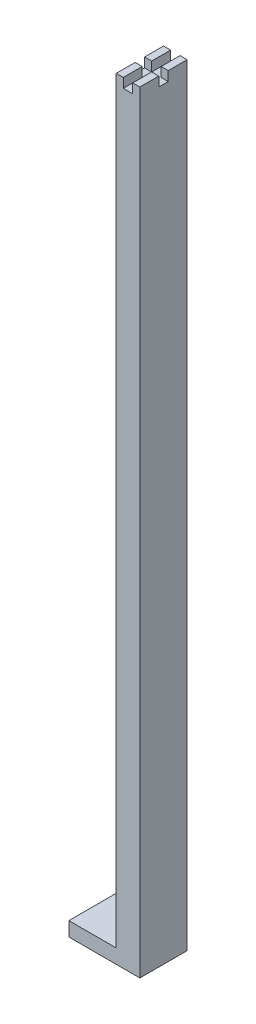
ISO-10303-21;
HEADER;
FILE_DESCRIPTION(('STEP AP214'),'2;1');
FILE_NAME('part.step','',(''),(''),'','','');
FILE_SCHEMA(('AUTOMOTIVE_DESIGN { 1 0 10303 214 1 1 1 1 }'));
ENDSEC;
DATA;
#1=APPLICATION_CONTEXT('core data for automotive mechanical design processes');
#2=APPLICATION_PROTOCOL_DEFINITION('international standard','automotive_design',2000,#1);
#3=PRODUCT_CONTEXT('',#1,'mechanical');
#4=PRODUCT('Part','Part','',(#3));
#5=PRODUCT_RELATED_PRODUCT_CATEGORY('part','',(#4));
#6=PRODUCT_DEFINITION_FORMATION('','',#4);
#7=PRODUCT_DEFINITION_CONTEXT('part definition',#1,'design');
#8=PRODUCT_DEFINITION('design','',#6,#7);
#9=PRODUCT_DEFINITION_SHAPE('','',#8);
#10=(LENGTH_UNIT() NAMED_UNIT(*) SI_UNIT(.MILLI.,.METRE.));
#11=(NAMED_UNIT(*) PLANE_ANGLE_UNIT() SI_UNIT($,.RADIAN.));
#12=(NAMED_UNIT(*) SI_UNIT($,.STERADIAN.) SOLID_ANGLE_UNIT());
#13=UNCERTAINTY_MEASURE_WITH_UNIT(LENGTH_MEASURE(1.E-05),#10,'distance_accuracy_value','');
#14=(GEOMETRIC_REPRESENTATION_CONTEXT(3) GLOBAL_UNCERTAINTY_ASSIGNED_CONTEXT((#13)) GLOBAL_UNIT_ASSIGNED_CONTEXT((#10,
#11,#12)) REPRESENTATION_CONTEXT('',''));
#15=CARTESIAN_POINT('',(0.,0.,0.));
#16=DIRECTION('',(0.,0.,1.));
#17=DIRECTION('',(1.,0.,0.));
#18=AXIS2_PLACEMENT_3D('',#15,#16,#17);
#19=CARTESIAN_POINT('',(0.,163.,0.));
#20=DIRECTION('',(0.,-1.,0.));
#21=DIRECTION('',(0.,0.,-1.));
#22=AXIS2_PLACEMENT_3D('',#19,#20,#21);
#23=PLANE('',#22);
#24=DIRECTION('',(-1.,0.,0.));
#25=VECTOR('',#24,1.);
#26=CARTESIAN_POINT('',(7.5,163.,-5.));
#27=LINE('',#26,#25);
#28=CARTESIAN_POINT('',(7.5,163.,-5.));
#29=VERTEX_POINT('',#28);
#30=CARTESIAN_POINT('',(6.,163.,-5.));
#31=VERTEX_POINT('',#30);
#32=EDGE_CURVE('E254',#29,#31,#27,.T.);
#33=ORIENTED_EDGE('',*,*,#32,.T.);
#34=DIRECTION('',(0.,0.,-1.));
#35=VECTOR('',#34,1.);
#36=CARTESIAN_POINT('',(6.,163.,-1.));
#37=LINE('',#36,#35);
#38=CARTESIAN_POINT('',(6.,163.,-1.));
#39=VERTEX_POINT('',#38);
#40=EDGE_CURVE('E180',#39,#31,#37,.T.);
#41=ORIENTED_EDGE('',*,*,#40,.F.);
#42=DIRECTION('',(-1.,0.,0.));
#43=VECTOR('',#42,1.);
#44=CARTESIAN_POINT('',(7.5,163.,-1.));
#45=LINE('',#44,#43);
#46=CARTESIAN_POINT('',(7.5,163.,-1.));
#47=VERTEX_POINT('',#46);
#48=EDGE_CURVE('E182',#47,#39,#45,.T.);
#49=ORIENTED_EDGE('',*,*,#48,.F.);
#50=DIRECTION('',(0.,0.,-1.));
#51=VECTOR('',#50,1.);
#52=CARTESIAN_POINT('',(7.5,163.,-5.));
#53=LINE('',#52,#51);
#54=EDGE_CURVE('E253',#47,#29,#53,.T.);
#55=ORIENTED_EDGE('',*,*,#54,.T.);
#56=EDGE_LOOP('',(#33,#41,#49,#55));
#57=FACE_BOUND('',#56,.T.);
#58=ADVANCED_FACE('F34',(#57),#23,.F.);
#59=CARTESIAN_POINT('',(7.5,163.,5.));
#60=VERTEX_POINT('',#59);
#61=CARTESIAN_POINT('',(7.5,163.,1.));
#62=VERTEX_POINT('',#61);
#63=EDGE_CURVE('E249',#60,#62,#53,.T.);
#64=ORIENTED_EDGE('',*,*,#63,.T.);
#65=DIRECTION('',(1.,0.,0.));
#66=VECTOR('',#65,1.);
#67=CARTESIAN_POINT('',(7.5,163.,1.));
#68=LINE('',#67,#66);
#69=CARTESIAN_POINT('',(6.,163.,1.));
#70=VERTEX_POINT('',#69);
#71=EDGE_CURVE('E221',#70,#62,#68,.T.);
#72=ORIENTED_EDGE('',*,*,#71,.F.);
#73=DIRECTION('',(0.,0.,-1.));
#74=VECTOR('',#73,1.);
#75=CARTESIAN_POINT('',(6.,163.,5.));
#76=LINE('',#75,#74);
#77=CARTESIAN_POINT('',(6.,163.,5.));
#78=VERTEX_POINT('',#77);
#79=EDGE_CURVE('E218',#78,#70,#76,.T.);
#80=ORIENTED_EDGE('',*,*,#79,.F.);
#81=DIRECTION('',(1.,0.,0.));
#82=VECTOR('',#81,1.);
#83=CARTESIAN_POINT('',(7.5,163.,5.));
#84=LINE('',#83,#82);
#85=EDGE_CURVE('E261',#78,#60,#84,.T.);
#86=ORIENTED_EDGE('',*,*,#85,.T.);
#87=EDGE_LOOP('',(#64,#72,#80,#86));
#88=FACE_BOUND('',#87,.T.);
#89=ADVANCED_FACE('F338',(#88),#23,.F.);
#90=CARTESIAN_POINT('',(2.5,163.,5.));
#91=VERTEX_POINT('',#90);
#92=CARTESIAN_POINT('',(4.,163.,5.));
#93=VERTEX_POINT('',#92);
#94=EDGE_CURVE('E262',#91,#93,#84,.T.);
#95=ORIENTED_EDGE('',*,*,#94,.T.);
#96=DIRECTION('',(0.,0.,1.));
#97=VECTOR('',#96,1.);
#98=CARTESIAN_POINT('',(4.,163.,5.));
#99=LINE('',#98,#97);
#100=CARTESIAN_POINT('',(4.,163.,1.));
#101=VERTEX_POINT('',#100);
#102=EDGE_CURVE('E216',#101,#93,#99,.T.);
#103=ORIENTED_EDGE('',*,*,#102,.F.);
#104=DIRECTION('',(1.,0.,0.));
#105=VECTOR('',#104,1.);
#106=CARTESIAN_POINT('',(4.,163.,1.));
#107=LINE('',#106,#105);
#108=CARTESIAN_POINT('',(2.5,163.,1.));
#109=VERTEX_POINT('',#108);
#110=EDGE_CURVE('E213',#109,#101,#107,.T.);
#111=ORIENTED_EDGE('',*,*,#110,.F.);
#112=DIRECTION('',(0.,0.,1.));
#113=VECTOR('',#112,1.);
#114=CARTESIAN_POINT('',(2.5,163.,-5.));
#115=LINE('',#114,#113);
#116=EDGE_CURVE('E257',#109,#91,#115,.T.);
#117=ORIENTED_EDGE('',*,*,#116,.T.);
#118=EDGE_LOOP('',(#95,#103,#111,#117));
#119=FACE_BOUND('',#118,.T.);
#120=ADVANCED_FACE('F351',(#119),#23,.F.);
#121=CARTESIAN_POINT('',(-7.5,3.,5.));
#122=DIRECTION('',(1.,0.,0.));
#123=DIRECTION('',(0.,0.,-1.));
#124=AXIS2_PLACEMENT_3D('',#121,#122,#123);
#125=PLANE('',#124);
#126=DIRECTION('',(0.,0.,1.));
#127=VECTOR('',#126,1.);
#128=CARTESIAN_POINT('',(-7.5,0.,5.));
#129=LINE('',#128,#127);
#130=CARTESIAN_POINT('',(-7.5,0.,-5.));
#131=VERTEX_POINT('',#130);
#132=CARTESIAN_POINT('',(-7.5,0.,5.));
#133=VERTEX_POINT('',#132);
#134=EDGE_CURVE('E272',#131,#133,#129,.T.);
#135=ORIENTED_EDGE('',*,*,#134,.T.);
#136=DIRECTION('',(0.,-1.,0.));
#137=VECTOR('',#136,1.);
#138=CARTESIAN_POINT('',(-7.5,3.,5.));
#139=LINE('',#138,#137);
#140=CARTESIAN_POINT('',(-7.5,3.,5.));
#141=VERTEX_POINT('',#140);
#142=EDGE_CURVE('E11',#141,#133,#139,.T.);
#143=ORIENTED_EDGE('',*,*,#142,.F.);
#144=DIRECTION('',(0.,0.,1.));
#145=VECTOR('',#144,1.);
#146=CARTESIAN_POINT('',(-7.5,3.,5.));
#147=LINE('',#146,#145);
#148=CARTESIAN_POINT('',(-7.5,3.,-5.));
#149=VERTEX_POINT('',#148);
#150=EDGE_CURVE('E273',#149,#141,#147,.T.);
#151=ORIENTED_EDGE('',*,*,#150,.F.);
#152=DIRECTION('',(0.,-1.,0.));
#153=VECTOR('',#152,1.);
#154=CARTESIAN_POINT('',(-7.5,3.,-5.));
#155=LINE('',#154,#153);
#156=EDGE_CURVE('E281',#149,#131,#155,.T.);
#157=ORIENTED_EDGE('',*,*,#156,.T.);
#158=EDGE_LOOP('',(#135,#143,#151,#157));
#159=FACE_BOUND('',#158,.T.);
#160=ADVANCED_FACE('F36',(#159),#125,.F.);
#161=CARTESIAN_POINT('',(7.5,3.,5.));
#162=DIRECTION('',(0.,0.,-1.));
#163=DIRECTION('',(-1.,0.,0.));
#164=AXIS2_PLACEMENT_3D('',#161,#162,#163);
#165=PLANE('',#164);
#166=ORIENTED_EDGE('',*,*,#85,.F.);
#167=DIRECTION('',(0.,1.,0.));
#168=VECTOR('',#167,1.);
#169=CARTESIAN_POINT('',(6.,161.,5.));
#170=LINE('',#169,#168);
#171=CARTESIAN_POINT('',(6.,161.,5.));
#172=VERTEX_POINT('',#171);
#173=EDGE_CURVE('E239',#172,#78,#170,.T.);
#174=ORIENTED_EDGE('',*,*,#173,.F.);
#175=DIRECTION('',(1.,0.,0.));
#176=VECTOR('',#175,1.);
#177=CARTESIAN_POINT('',(6.,161.,5.));
#178=LINE('',#177,#176);
#179=CARTESIAN_POINT('',(4.,161.,5.));
#180=VERTEX_POINT('',#179);
#181=EDGE_CURVE('E192',#180,#172,#178,.T.);
#182=ORIENTED_EDGE('',*,*,#181,.F.);
#183=DIRECTION('',(0.,1.,0.));
#184=VECTOR('',#183,1.);
#185=CARTESIAN_POINT('',(4.,161.,5.));
#186=LINE('',#185,#184);
#187=EDGE_CURVE('E241',#180,#93,#186,.T.);
#188=ORIENTED_EDGE('',*,*,#187,.T.);
#189=ORIENTED_EDGE('',*,*,#94,.F.);
#190=DIRECTION('',(0.,-1.,0.));
#191=VECTOR('',#190,1.);
#192=CARTESIAN_POINT('',(2.5,163.,5.));
#193=LINE('',#192,#191);
#194=CARTESIAN_POINT('',(2.5,3.,5.));
#195=VERTEX_POINT('',#194);
#196=EDGE_CURVE('E265',#91,#195,#193,.T.);
#197=ORIENTED_EDGE('',*,*,#196,.T.);
#198=DIRECTION('',(1.,0.,0.));
#199=VECTOR('',#198,1.);
#200=CARTESIAN_POINT('',(7.5,3.,5.));
#201=LINE('',#200,#199);
#202=EDGE_CURVE('E276',#141,#195,#201,.T.);
#203=ORIENTED_EDGE('',*,*,#202,.F.);
#204=ORIENTED_EDGE('',*,*,#142,.T.);
#205=DIRECTION('',(1.,0.,0.));
#206=VECTOR('',#205,1.);
#207=CARTESIAN_POINT('',(7.5,0.,5.));
#208=LINE('',#207,#206);
#209=CARTESIAN_POINT('',(7.5,0.,5.));
#210=VERTEX_POINT('',#209);
#211=EDGE_CURVE('E284',#133,#210,#208,.T.);
#212=ORIENTED_EDGE('',*,*,#211,.T.);
#213=DIRECTION('',(0.,-1.,0.));
#214=VECTOR('',#213,1.);
#215=CARTESIAN_POINT('',(7.5,3.,5.));
#216=LINE('',#215,#214);
#217=EDGE_CURVE('E42',#60,#210,#216,.T.);
#218=ORIENTED_EDGE('',*,*,#217,.F.);
#219=EDGE_LOOP('',(#166,#174,#182,#188,#189,#197,#203,#204,#212,#218));
#220=FACE_BOUND('',#219,.T.);
#221=ADVANCED_FACE('F341',(#220),#165,.F.);
#222=CARTESIAN_POINT('',(7.5,3.,5.));
#223=DIRECTION('',(-1.,0.,0.));
#224=DIRECTION('',(0.,0.,1.));
#225=AXIS2_PLACEMENT_3D('',#222,#223,#224);
#226=PLANE('',#225);
#227=ORIENTED_EDGE('',*,*,#54,.F.);
#228=DIRECTION('',(0.,1.,0.));
#229=VECTOR('',#228,1.);
#230=CARTESIAN_POINT('',(7.5,161.,-1.));
#231=LINE('',#230,#229);
#232=CARTESIAN_POINT('',(7.5,161.,-1.));
#233=VERTEX_POINT('',#232);
#234=EDGE_CURVE('E232',#233,#47,#231,.T.);
#235=ORIENTED_EDGE('',*,*,#234,.F.);
#236=DIRECTION('',(0.,0.,-1.));
#237=VECTOR('',#236,1.);
#238=CARTESIAN_POINT('',(7.5,161.,1.));
#239=LINE('',#238,#237);
#240=CARTESIAN_POINT('',(7.5,161.,1.));
#241=VERTEX_POINT('',#240);
#242=EDGE_CURVE('E201',#241,#233,#239,.T.);
#243=ORIENTED_EDGE('',*,*,#242,.F.);
#244=DIRECTION('',(0.,1.,0.));
#245=VECTOR('',#244,1.);
#246=CARTESIAN_POINT('',(7.5,161.,1.));
#247=LINE('',#246,#245);
#248=EDGE_CURVE('E234',#241,#62,#247,.T.);
#249=ORIENTED_EDGE('',*,*,#248,.T.);
#250=ORIENTED_EDGE('',*,*,#63,.F.);
#251=ORIENTED_EDGE('',*,*,#217,.T.);
#252=DIRECTION('',(0.,0.,-1.));
#253=VECTOR('',#252,1.);
#254=CARTESIAN_POINT('',(7.5,0.,5.));
#255=LINE('',#254,#253);
#256=CARTESIAN_POINT('',(7.5,0.,-5.));
#257=VERTEX_POINT('',#256);
#258=EDGE_CURVE('E286',#210,#257,#255,.T.);
#259=ORIENTED_EDGE('',*,*,#258,.T.);
#260=DIRECTION('',(0.,-1.,0.));
#261=VECTOR('',#260,1.);
#262=CARTESIAN_POINT('',(7.5,3.,-5.));
#263=LINE('',#262,#261);
#264=EDGE_CURVE('E291',#29,#257,#263,.T.);
#265=ORIENTED_EDGE('',*,*,#264,.F.);
#266=EDGE_LOOP('',(#227,#235,#243,#249,#250,#251,#259,#265));
#267=FACE_BOUND('',#266,.T.);
#268=ADVANCED_FACE('F299',(#267),#226,.F.);
#269=CARTESIAN_POINT('',(7.5,3.,-5.));
#270=DIRECTION('',(0.,0.,1.));
#271=DIRECTION('',(1.,0.,0.));
#272=AXIS2_PLACEMENT_3D('',#269,#270,#271);
#273=PLANE('',#272);
#274=CARTESIAN_POINT('',(4.,163.,-5.));
#275=VERTEX_POINT('',#274);
#276=CARTESIAN_POINT('',(2.5,163.,-5.));
#277=VERTEX_POINT('',#276);
#278=EDGE_CURVE('E252',#275,#277,#27,.T.);
#279=ORIENTED_EDGE('',*,*,#278,.F.);
#280=DIRECTION('',(0.,1.,0.));
#281=VECTOR('',#280,1.);
#282=CARTESIAN_POINT('',(4.,161.,-5.));
#283=LINE('',#282,#281);
#284=CARTESIAN_POINT('',(4.,161.,-5.));
#285=VERTEX_POINT('',#284);
#286=EDGE_CURVE('E225',#285,#275,#283,.T.);
#287=ORIENTED_EDGE('',*,*,#286,.F.);
#288=DIRECTION('',(-1.,0.,0.));
#289=VECTOR('',#288,1.);
#290=CARTESIAN_POINT('',(6.,161.,-5.));
#291=LINE('',#290,#289);
#292=CARTESIAN_POINT('',(6.,161.,-5.));
#293=VERTEX_POINT('',#292);
#294=EDGE_CURVE('E165',#293,#285,#291,.T.);
#295=ORIENTED_EDGE('',*,*,#294,.F.);
#296=DIRECTION('',(0.,1.,0.));
#297=VECTOR('',#296,1.);
#298=CARTESIAN_POINT('',(6.,161.,-5.));
#299=LINE('',#298,#297);
#300=EDGE_CURVE('E227',#293,#31,#299,.T.);
#301=ORIENTED_EDGE('',*,*,#300,.T.);
#302=ORIENTED_EDGE('',*,*,#32,.F.);
#303=ORIENTED_EDGE('',*,*,#264,.T.);
#304=DIRECTION('',(-1.,0.,0.));
#305=VECTOR('',#304,1.);
#306=CARTESIAN_POINT('',(7.5,0.,-5.));
#307=LINE('',#306,#305);
#308=EDGE_CURVE('E277',#257,#131,#307,.T.);
#309=ORIENTED_EDGE('',*,*,#308,.T.);
#310=ORIENTED_EDGE('',*,*,#156,.F.);
#311=DIRECTION('',(-1.,0.,0.));
#312=VECTOR('',#311,1.);
#313=CARTESIAN_POINT('',(7.5,3.,-5.));
#314=LINE('',#313,#312);
#315=CARTESIAN_POINT('',(2.5,3.,-5.));
#316=VERTEX_POINT('',#315);
#317=EDGE_CURVE('E279',#316,#149,#314,.T.);
#318=ORIENTED_EDGE('',*,*,#317,.F.);
#319=DIRECTION('',(0.,-1.,0.));
#320=VECTOR('',#319,1.);
#321=CARTESIAN_POINT('',(2.5,163.,-5.));
#322=LINE('',#321,#320);
#323=EDGE_CURVE('E269',#277,#316,#322,.T.);
#324=ORIENTED_EDGE('',*,*,#323,.F.);
#325=EDGE_LOOP('',(#279,#287,#295,#301,#302,#303,#309,#310,#318,#324));
#326=FACE_BOUND('',#325,.T.);
#327=ADVANCED_FACE('F310',(#326),#273,.F.);
#328=CARTESIAN_POINT('',(0.,3.,0.));
#329=DIRECTION('',(0.,1.,0.));
#330=DIRECTION('',(0.,0.,1.));
#331=AXIS2_PLACEMENT_3D('',#328,#329,#330);
#332=PLANE('',#331);
#333=DIRECTION('',(0.,0.,1.));
#334=VECTOR('',#333,1.);
#335=CARTESIAN_POINT('',(2.5,3.,-5.));
#336=LINE('',#335,#334);
#337=EDGE_CURVE('E57',#316,#195,#336,.T.);
#338=ORIENTED_EDGE('',*,*,#337,.F.);
#339=ORIENTED_EDGE('',*,*,#317,.T.);
#340=ORIENTED_EDGE('',*,*,#150,.T.);
#341=ORIENTED_EDGE('',*,*,#202,.T.);
#342=EDGE_LOOP('',(#338,#339,#340,#341));
#343=FACE_BOUND('',#342,.T.);
#344=ADVANCED_FACE('F315',(#343),#332,.T.);
#345=CARTESIAN_POINT('',(0.,0.,0.));
#346=DIRECTION('',(0.,1.,0.));
#347=DIRECTION('',(0.,0.,1.));
#348=AXIS2_PLACEMENT_3D('',#345,#346,#347);
#349=PLANE('',#348);
#350=ORIENTED_EDGE('',*,*,#134,.F.);
#351=ORIENTED_EDGE('',*,*,#308,.F.);
#352=ORIENTED_EDGE('',*,*,#258,.F.);
#353=ORIENTED_EDGE('',*,*,#211,.F.);
#354=EDGE_LOOP('',(#350,#351,#352,#353));
#355=FACE_BOUND('',#354,.T.);
#356=ADVANCED_FACE('F306',(#355),#349,.F.);
#357=CARTESIAN_POINT('',(2.5,163.,-5.));
#358=DIRECTION('',(1.,0.,0.));
#359=DIRECTION('',(0.,0.,-1.));
#360=AXIS2_PLACEMENT_3D('',#357,#358,#359);
#361=PLANE('',#360);
#362=ORIENTED_EDGE('',*,*,#116,.F.);
#363=DIRECTION('',(0.,1.,0.));
#364=VECTOR('',#363,1.);
#365=CARTESIAN_POINT('',(2.5,161.,1.));
#366=LINE('',#365,#364);
#367=CARTESIAN_POINT('',(2.5,161.,1.));
#368=VERTEX_POINT('',#367);
#369=EDGE_CURVE('E246',#368,#109,#366,.T.);
#370=ORIENTED_EDGE('',*,*,#369,.F.);
#371=DIRECTION('',(0.,0.,1.));
#372=VECTOR('',#371,1.);
#373=CARTESIAN_POINT('',(2.5,161.,1.));
#374=LINE('',#373,#372);
#375=CARTESIAN_POINT('',(2.5,161.,-1.));
#376=VERTEX_POINT('',#375);
#377=EDGE_CURVE('E174',#376,#368,#374,.T.);
#378=ORIENTED_EDGE('',*,*,#377,.F.);
#379=DIRECTION('',(0.,1.,0.));
#380=VECTOR('',#379,1.);
#381=CARTESIAN_POINT('',(2.5,161.,-1.));
#382=LINE('',#381,#380);
#383=CARTESIAN_POINT('',(2.5,163.,-1.));
#384=VERTEX_POINT('',#383);
#385=EDGE_CURVE('E164',#376,#384,#382,.T.);
#386=ORIENTED_EDGE('',*,*,#385,.T.);
#387=EDGE_CURVE('E258',#277,#384,#115,.T.);
#388=ORIENTED_EDGE('',*,*,#387,.F.);
#389=ORIENTED_EDGE('',*,*,#323,.T.);
#390=ORIENTED_EDGE('',*,*,#337,.T.);
#391=ORIENTED_EDGE('',*,*,#196,.F.);
#392=EDGE_LOOP('',(#362,#370,#378,#386,#388,#389,#390,#391));
#393=FACE_BOUND('',#392,.T.);
#394=ADVANCED_FACE('F320',(#393),#361,.F.);
#395=DIRECTION('',(-1.,0.,0.));
#396=VECTOR('',#395,1.);
#397=CARTESIAN_POINT('',(4.,163.,-1.));
#398=LINE('',#397,#396);
#399=CARTESIAN_POINT('',(4.,163.,-1.));
#400=VERTEX_POINT('',#399);
#401=EDGE_CURVE('E211',#400,#384,#398,.T.);
#402=ORIENTED_EDGE('',*,*,#401,.F.);
#403=DIRECTION('',(0.,0.,1.));
#404=VECTOR('',#403,1.);
#405=CARTESIAN_POINT('',(4.,163.,-1.));
#406=LINE('',#405,#404);
#407=EDGE_CURVE('E49',#275,#400,#406,.T.);
#408=ORIENTED_EDGE('',*,*,#407,.F.);
#409=ORIENTED_EDGE('',*,*,#278,.T.);
#410=ORIENTED_EDGE('',*,*,#387,.T.);
#411=EDGE_LOOP('',(#402,#408,#409,#410));
#412=FACE_BOUND('',#411,.T.);
#413=ADVANCED_FACE('F323',(#412),#23,.F.);
#414=CARTESIAN_POINT('',(4.,161.,-1.));
#415=DIRECTION('',(-1.,0.,0.));
#416=DIRECTION('',(0.,0.,1.));
#417=AXIS2_PLACEMENT_3D('',#414,#415,#416);
#418=PLANE('',#417);
#419=ORIENTED_EDGE('',*,*,#407,.T.);
#420=DIRECTION('',(0.,1.,0.));
#421=VECTOR('',#420,1.);
#422=CARTESIAN_POINT('',(4.,161.,-1.));
#423=LINE('',#422,#421);
#424=CARTESIAN_POINT('',(4.,161.,-1.));
#425=VERTEX_POINT('',#424);
#426=EDGE_CURVE('E156',#425,#400,#423,.T.);
#427=ORIENTED_EDGE('',*,*,#426,.F.);
#428=DIRECTION('',(0.,0.,1.));
#429=VECTOR('',#428,1.);
#430=CARTESIAN_POINT('',(4.,161.,-1.));
#431=LINE('',#430,#429);
#432=EDGE_CURVE('E160',#285,#425,#431,.T.);
#433=ORIENTED_EDGE('',*,*,#432,.F.);
#434=ORIENTED_EDGE('',*,*,#286,.T.);
#435=EDGE_LOOP('',(#419,#427,#433,#434));
#436=FACE_BOUND('',#435,.T.);
#437=ADVANCED_FACE('F158',(#436),#418,.F.);
#438=CARTESIAN_POINT('',(6.,161.,-1.));
#439=DIRECTION('',(1.,0.,0.));
#440=DIRECTION('',(0.,0.,-1.));
#441=AXIS2_PLACEMENT_3D('',#438,#439,#440);
#442=PLANE('',#441);
#443=ORIENTED_EDGE('',*,*,#40,.T.);
#444=ORIENTED_EDGE('',*,*,#300,.F.);
#445=DIRECTION('',(0.,0.,-1.));
#446=VECTOR('',#445,1.);
#447=CARTESIAN_POINT('',(6.,161.,-1.));
#448=LINE('',#447,#446);
#449=CARTESIAN_POINT('',(6.,161.,-1.));
#450=VERTEX_POINT('',#449);
#451=EDGE_CURVE('E207',#450,#293,#448,.T.);
#452=ORIENTED_EDGE('',*,*,#451,.F.);
#453=DIRECTION('',(0.,1.,0.));
#454=VECTOR('',#453,1.);
#455=CARTESIAN_POINT('',(6.,161.,-1.));
#456=LINE('',#455,#454);
#457=EDGE_CURVE('E230',#450,#39,#456,.T.);
#458=ORIENTED_EDGE('',*,*,#457,.T.);
#459=EDGE_LOOP('',(#443,#444,#452,#458));
#460=FACE_BOUND('',#459,.T.);
#461=ADVANCED_FACE('F376',(#460),#442,.F.);
#462=CARTESIAN_POINT('',(7.5,161.,-1.));
#463=DIRECTION('',(0.,0.,-1.));
#464=DIRECTION('',(-1.,0.,0.));
#465=AXIS2_PLACEMENT_3D('',#462,#463,#464);
#466=PLANE('',#465);
#467=ORIENTED_EDGE('',*,*,#48,.T.);
#468=ORIENTED_EDGE('',*,*,#457,.F.);
#469=DIRECTION('',(-1.,0.,0.));
#470=VECTOR('',#469,1.);
#471=CARTESIAN_POINT('',(7.5,161.,-1.));
#472=LINE('',#471,#470);
#473=EDGE_CURVE('E204',#233,#450,#472,.T.);
#474=ORIENTED_EDGE('',*,*,#473,.F.);
#475=ORIENTED_EDGE('',*,*,#234,.T.);
#476=EDGE_LOOP('',(#467,#468,#474,#475));
#477=FACE_BOUND('',#476,.T.);
#478=ADVANCED_FACE('F332',(#477),#466,.F.);
#479=CARTESIAN_POINT('',(7.5,161.,1.));
#480=DIRECTION('',(0.,0.,1.));
#481=DIRECTION('',(1.,0.,0.));
#482=AXIS2_PLACEMENT_3D('',#479,#480,#481);
#483=PLANE('',#482);
#484=ORIENTED_EDGE('',*,*,#71,.T.);
#485=ORIENTED_EDGE('',*,*,#248,.F.);
#486=DIRECTION('',(1.,0.,0.));
#487=VECTOR('',#486,1.);
#488=CARTESIAN_POINT('',(7.5,161.,1.));
#489=LINE('',#488,#487);
#490=CARTESIAN_POINT('',(6.,161.,1.));
#491=VERTEX_POINT('',#490);
#492=EDGE_CURVE('E198',#491,#241,#489,.T.);
#493=ORIENTED_EDGE('',*,*,#492,.F.);
#494=DIRECTION('',(0.,1.,0.));
#495=VECTOR('',#494,1.);
#496=CARTESIAN_POINT('',(6.,161.,1.));
#497=LINE('',#496,#495);
#498=EDGE_CURVE('E237',#491,#70,#497,.T.);
#499=ORIENTED_EDGE('',*,*,#498,.T.);
#500=EDGE_LOOP('',(#484,#485,#493,#499));
#501=FACE_BOUND('',#500,.T.);
#502=ADVANCED_FACE('F335',(#501),#483,.F.);
#503=CARTESIAN_POINT('',(6.,161.,5.));
#504=DIRECTION('',(1.,0.,0.));
#505=DIRECTION('',(0.,0.,-1.));
#506=AXIS2_PLACEMENT_3D('',#503,#504,#505);
#507=PLANE('',#506);
#508=ORIENTED_EDGE('',*,*,#79,.T.);
#509=ORIENTED_EDGE('',*,*,#498,.F.);
#510=DIRECTION('',(0.,0.,-1.));
#511=VECTOR('',#510,1.);
#512=CARTESIAN_POINT('',(6.,161.,5.));
#513=LINE('',#512,#511);
#514=EDGE_CURVE('E195',#172,#491,#513,.T.);
#515=ORIENTED_EDGE('',*,*,#514,.F.);
#516=ORIENTED_EDGE('',*,*,#173,.T.);
#517=EDGE_LOOP('',(#508,#509,#515,#516));
#518=FACE_BOUND('',#517,.T.);
#519=ADVANCED_FACE('F344',(#518),#507,.F.);
#520=CARTESIAN_POINT('',(4.,161.,5.));
#521=DIRECTION('',(-1.,0.,0.));
#522=DIRECTION('',(0.,0.,1.));
#523=AXIS2_PLACEMENT_3D('',#520,#521,#522);
#524=PLANE('',#523);
#525=ORIENTED_EDGE('',*,*,#102,.T.);
#526=ORIENTED_EDGE('',*,*,#187,.F.);
#527=DIRECTION('',(0.,0.,1.));
#528=VECTOR('',#527,1.);
#529=CARTESIAN_POINT('',(4.,161.,5.));
#530=LINE('',#529,#528);
#531=CARTESIAN_POINT('',(4.,161.,1.));
#532=VERTEX_POINT('',#531);
#533=EDGE_CURVE('E189',#532,#180,#530,.T.);
#534=ORIENTED_EDGE('',*,*,#533,.F.);
#535=DIRECTION('',(0.,1.,0.));
#536=VECTOR('',#535,1.);
#537=CARTESIAN_POINT('',(4.,161.,1.));
#538=LINE('',#537,#536);
#539=EDGE_CURVE('E244',#532,#101,#538,.T.);
#540=ORIENTED_EDGE('',*,*,#539,.T.);
#541=EDGE_LOOP('',(#525,#526,#534,#540));
#542=FACE_BOUND('',#541,.T.);
#543=ADVANCED_FACE('F347',(#542),#524,.F.);
#544=CARTESIAN_POINT('',(4.,161.,1.));
#545=DIRECTION('',(0.,0.,1.));
#546=DIRECTION('',(1.,0.,0.));
#547=AXIS2_PLACEMENT_3D('',#544,#545,#546);
#548=PLANE('',#547);
#549=ORIENTED_EDGE('',*,*,#110,.T.);
#550=ORIENTED_EDGE('',*,*,#539,.F.);
#551=DIRECTION('',(1.,0.,0.));
#552=VECTOR('',#551,1.);
#553=CARTESIAN_POINT('',(4.,161.,1.));
#554=LINE('',#553,#552);
#555=EDGE_CURVE('E186',#368,#532,#554,.T.);
#556=ORIENTED_EDGE('',*,*,#555,.F.);
#557=ORIENTED_EDGE('',*,*,#369,.T.);
#558=EDGE_LOOP('',(#549,#550,#556,#557));
#559=FACE_BOUND('',#558,.T.);
#560=ADVANCED_FACE('F355',(#559),#548,.F.);
#561=CARTESIAN_POINT('',(4.,161.,-1.));
#562=DIRECTION('',(0.,0.,-1.));
#563=DIRECTION('',(-1.,0.,0.));
#564=AXIS2_PLACEMENT_3D('',#561,#562,#563);
#565=PLANE('',#564);
#566=ORIENTED_EDGE('',*,*,#401,.T.);
#567=ORIENTED_EDGE('',*,*,#385,.F.);
#568=DIRECTION('',(-1.,0.,0.));
#569=VECTOR('',#568,1.);
#570=CARTESIAN_POINT('',(4.,161.,-1.));
#571=LINE('',#570,#569);
#572=EDGE_CURVE('E168',#425,#376,#571,.T.);
#573=ORIENTED_EDGE('',*,*,#572,.F.);
#574=ORIENTED_EDGE('',*,*,#426,.T.);
#575=EDGE_LOOP('',(#566,#567,#573,#574));
#576=FACE_BOUND('',#575,.T.);
#577=ADVANCED_FACE('F169',(#576),#565,.F.);
#578=CARTESIAN_POINT('',(0.,161.,0.));
#579=DIRECTION('',(0.,1.,0.));
#580=DIRECTION('',(0.,0.,1.));
#581=AXIS2_PLACEMENT_3D('',#578,#579,#580);
#582=PLANE('',#581);
#583=ORIENTED_EDGE('',*,*,#432,.T.);
#584=ORIENTED_EDGE('',*,*,#572,.T.);
#585=ORIENTED_EDGE('',*,*,#377,.T.);
#586=ORIENTED_EDGE('',*,*,#555,.T.);
#587=ORIENTED_EDGE('',*,*,#533,.T.);
#588=ORIENTED_EDGE('',*,*,#181,.T.);
#589=ORIENTED_EDGE('',*,*,#514,.T.);
#590=ORIENTED_EDGE('',*,*,#492,.T.);
#591=ORIENTED_EDGE('',*,*,#242,.T.);
#592=ORIENTED_EDGE('',*,*,#473,.T.);
#593=ORIENTED_EDGE('',*,*,#451,.T.);
#594=ORIENTED_EDGE('',*,*,#294,.T.);
#595=EDGE_LOOP('',(#583,#584,#585,#586,#587,#588,#589,#590,#591,#592,#593,#594));
#596=FACE_BOUND('',#595,.T.);
#597=ADVANCED_FACE('F176',(#596),#582,.T.);
#598=CLOSED_SHELL('',(#58,#89,#120,#160,#221,#268,#327,#344,#356,#394,#413,#437,#461,#478,#502,
#519,#543,#560,#577,#597));
#599=MANIFOLD_SOLID_BREP('B2',#598);
#600=ADVANCED_BREP_SHAPE_REPRESENTATION('',(#18,#599),#14);
#601=SHAPE_DEFINITION_REPRESENTATION(#9,#600);
ENDSEC;
END-ISO-10303-21;
